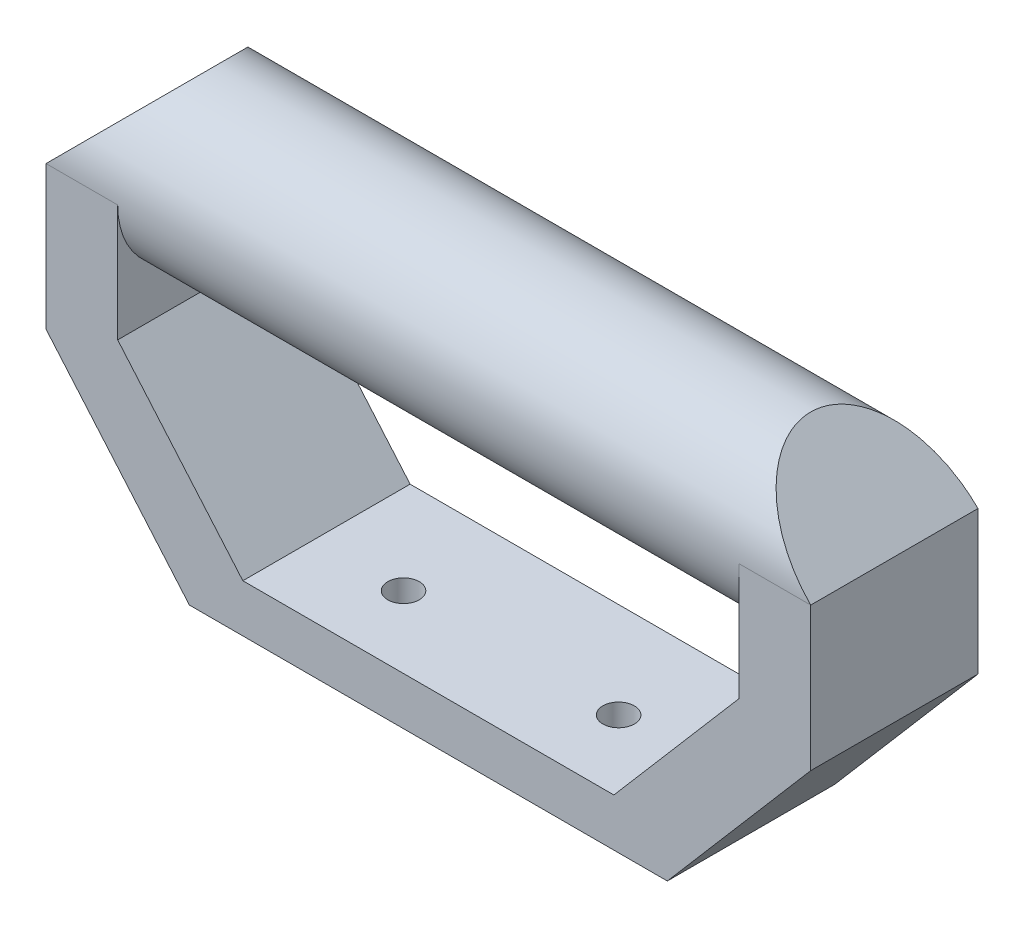
ISO-10303-21;
HEADER;
FILE_DESCRIPTION(('STEP AP214'),'2;1');
FILE_NAME('part.step','',(''),(''),'','','');
FILE_SCHEMA(('AUTOMOTIVE_DESIGN { 1 0 10303 214 1 1 1 1 }'));
ENDSEC;
DATA;
#1=APPLICATION_CONTEXT('core data for automotive mechanical design processes');
#2=APPLICATION_PROTOCOL_DEFINITION('international standard','automotive_design',2000,#1);
#3=PRODUCT_CONTEXT('',#1,'mechanical');
#4=PRODUCT('Part','Part','',(#3));
#5=PRODUCT_RELATED_PRODUCT_CATEGORY('part','',(#4));
#6=PRODUCT_DEFINITION_FORMATION('','',#4);
#7=PRODUCT_DEFINITION_CONTEXT('part definition',#1,'design');
#8=PRODUCT_DEFINITION('design','',#6,#7);
#9=PRODUCT_DEFINITION_SHAPE('','',#8);
#10=(LENGTH_UNIT() NAMED_UNIT(*) SI_UNIT(.MILLI.,.METRE.));
#11=(NAMED_UNIT(*) PLANE_ANGLE_UNIT() SI_UNIT($,.RADIAN.));
#12=(NAMED_UNIT(*) SI_UNIT($,.STERADIAN.) SOLID_ANGLE_UNIT());
#13=UNCERTAINTY_MEASURE_WITH_UNIT(LENGTH_MEASURE(1.E-05),#10,'distance_accuracy_value','');
#14=(GEOMETRIC_REPRESENTATION_CONTEXT(3) GLOBAL_UNCERTAINTY_ASSIGNED_CONTEXT((#13)) GLOBAL_UNIT_ASSIGNED_CONTEXT((#10,
#11,#12)) REPRESENTATION_CONTEXT('',''));
#15=CARTESIAN_POINT('',(0.,0.,0.));
#16=DIRECTION('',(0.,0.,1.));
#17=DIRECTION('',(1.,0.,0.));
#18=AXIS2_PLACEMENT_3D('',#15,#16,#17);
#19=CARTESIAN_POINT('',(0.,10.,0.));
#20=DIRECTION('',(0.,0.,-1.));
#21=DIRECTION('',(-1.,0.,0.));
#22=AXIS2_PLACEMENT_3D('',#19,#20,#21);
#23=PLANE('',#22);
#24=DIRECTION('',(1.,0.,0.));
#25=VECTOR('',#24,1.);
#26=CARTESIAN_POINT('',(0.,0.,0.));
#27=LINE('',#26,#25);
#28=CARTESIAN_POINT('',(0.,0.,0.));
#29=VERTEX_POINT('',#28);
#30=CARTESIAN_POINT('',(100.,0.,0.));
#31=VERTEX_POINT('',#30);
#32=EDGE_CURVE('E250',#29,#31,#27,.T.);
#33=ORIENTED_EDGE('',*,*,#32,.T.);
#34=DIRECTION('',(0.650791373455968,0.759256602365297,0.));
#35=VECTOR('',#34,1.);
#36=CARTESIAN_POINT('',(100.,0.,0.));
#37=LINE('',#36,#35);
#38=CARTESIAN_POINT('',(130.,35.,0.));
#39=VERTEX_POINT('',#38);
#40=EDGE_CURVE('E189',#31,#39,#37,.T.);
#41=ORIENTED_EDGE('',*,*,#40,.T.);
#42=DIRECTION('',(0.,1.,0.));
#43=VECTOR('',#42,1.);
#44=CARTESIAN_POINT('',(130.,35.,0.));
#45=LINE('',#44,#43);
#46=CARTESIAN_POINT('',(130.,65.,0.));
#47=VERTEX_POINT('',#46);
#48=EDGE_CURVE('E178',#39,#47,#45,.T.);
#49=ORIENTED_EDGE('',*,*,#48,.T.);
#50=DIRECTION('',(1.,0.,0.));
#51=VECTOR('',#50,1.);
#52=CARTESIAN_POINT('',(122.5,65.,0.));
#53=LINE('',#52,#51);
#54=CARTESIAN_POINT('',(115.,65.,0.));
#55=VERTEX_POINT('',#54);
#56=EDGE_CURVE('E57',#55,#47,#53,.T.);
#57=ORIENTED_EDGE('',*,*,#56,.F.);
#58=DIRECTION('',(0.,-1.,0.));
#59=VECTOR('',#58,1.);
#60=CARTESIAN_POINT('',(115.,65.,0.));
#61=LINE('',#60,#59);
#62=CARTESIAN_POINT('',(115.,40.5488611432322,0.));
#63=VERTEX_POINT('',#62);
#64=EDGE_CURVE('E196',#55,#63,#61,.T.);
#65=ORIENTED_EDGE('',*,*,#64,.T.);
#66=DIRECTION('',(-0.650791373455969,-0.759256602365296,0.));
#67=VECTOR('',#66,1.);
#68=CARTESIAN_POINT('',(115.,40.5488611432322,0.));
#69=LINE('',#68,#67);
#70=CARTESIAN_POINT('',(88.8152618772295,10.,0.));
#71=VERTEX_POINT('',#70);
#72=EDGE_CURVE('E193',#63,#71,#69,.T.);
#73=ORIENTED_EDGE('',*,*,#72,.T.);
#74=DIRECTION('',(1.,0.,0.));
#75=VECTOR('',#74,1.);
#76=CARTESIAN_POINT('',(0.,10.,0.));
#77=LINE('',#76,#75);
#78=CARTESIAN_POINT('',(11.1847381227705,10.,0.));
#79=VERTEX_POINT('',#78);
#80=EDGE_CURVE('E141',#79,#71,#77,.T.);
#81=ORIENTED_EDGE('',*,*,#80,.F.);
#82=DIRECTION('',(-0.650791373455969,0.759256602365296,0.));
#83=VECTOR('',#82,1.);
#84=CARTESIAN_POINT('',(-15.,40.5488611432322,0.));
#85=LINE('',#84,#83);
#86=CARTESIAN_POINT('',(-15.,40.5488611432322,0.));
#87=VERTEX_POINT('',#86);
#88=EDGE_CURVE('E198',#79,#87,#85,.T.);
#89=ORIENTED_EDGE('',*,*,#88,.T.);
#90=DIRECTION('',(0.,1.,0.));
#91=VECTOR('',#90,1.);
#92=CARTESIAN_POINT('',(-15.,65.,0.));
#93=LINE('',#92,#91);
#94=CARTESIAN_POINT('',(-15.,65.,0.));
#95=VERTEX_POINT('',#94);
#96=EDGE_CURVE('E219',#87,#95,#93,.T.);
#97=ORIENTED_EDGE('',*,*,#96,.T.);
#98=DIRECTION('',(1.,0.,0.));
#99=VECTOR('',#98,1.);
#100=CARTESIAN_POINT('',(-22.5,65.,0.));
#101=LINE('',#100,#99);
#102=CARTESIAN_POINT('',(-30.,65.,0.));
#103=VERTEX_POINT('',#102);
#104=EDGE_CURVE('E263',#95,#103,#101,.F.);
#105=ORIENTED_EDGE('',*,*,#104,.T.);
#106=DIRECTION('',(0.,-1.,0.));
#107=VECTOR('',#106,1.);
#108=CARTESIAN_POINT('',(-30.,35.,0.));
#109=LINE('',#108,#107);
#110=CARTESIAN_POINT('',(-30.,35.,0.));
#111=VERTEX_POINT('',#110);
#112=EDGE_CURVE('E73',#103,#111,#109,.T.);
#113=ORIENTED_EDGE('',*,*,#112,.T.);
#114=DIRECTION('',(0.650791373455968,-0.759256602365297,0.));
#115=VECTOR('',#114,1.);
#116=CARTESIAN_POINT('',(0.,0.,0.));
#117=LINE('',#116,#115);
#118=EDGE_CURVE('E225',#111,#29,#117,.T.);
#119=ORIENTED_EDGE('',*,*,#118,.T.);
#120=EDGE_LOOP('',(#33,#41,#49,#57,#65,#73,#81,#89,#97,#105,#113,#119));
#121=FACE_BOUND('',#120,.T.);
#122=ADVANCED_FACE('F47',(#121),#23,.F.);
#123=CARTESIAN_POINT('',(0.,10.,-35.));
#124=DIRECTION('',(0.,0.,1.));
#125=DIRECTION('',(1.,0.,0.));
#126=AXIS2_PLACEMENT_3D('',#123,#124,#125);
#127=PLANE('',#126);
#128=DIRECTION('',(-0.650791373455968,-0.759256602365297,0.));
#129=VECTOR('',#128,1.);
#130=CARTESIAN_POINT('',(100.,0.,-35.));
#131=LINE('',#130,#129);
#132=CARTESIAN_POINT('',(130.,35.,-35.));
#133=VERTEX_POINT('',#132);
#134=CARTESIAN_POINT('',(100.,0.,-35.));
#135=VERTEX_POINT('',#134);
#136=EDGE_CURVE('E186',#133,#135,#131,.T.);
#137=ORIENTED_EDGE('',*,*,#136,.T.);
#138=DIRECTION('',(-1.,0.,0.));
#139=VECTOR('',#138,1.);
#140=CARTESIAN_POINT('',(0.,0.,-35.));
#141=LINE('',#140,#139);
#142=CARTESIAN_POINT('',(0.,0.,-35.));
#143=VERTEX_POINT('',#142);
#144=EDGE_CURVE('E245',#135,#143,#141,.T.);
#145=ORIENTED_EDGE('',*,*,#144,.T.);
#146=DIRECTION('',(-0.650791373455968,0.759256602365297,0.));
#147=VECTOR('',#146,1.);
#148=CARTESIAN_POINT('',(0.,0.,-35.));
#149=LINE('',#148,#147);
#150=CARTESIAN_POINT('',(-30.,35.,-35.));
#151=VERTEX_POINT('',#150);
#152=EDGE_CURVE('E213',#143,#151,#149,.T.);
#153=ORIENTED_EDGE('',*,*,#152,.T.);
#154=DIRECTION('',(0.,1.,0.));
#155=VECTOR('',#154,1.);
#156=CARTESIAN_POINT('',(-30.,35.,-35.));
#157=LINE('',#156,#155);
#158=CARTESIAN_POINT('',(-29.9999999999999,65.,-35.));
#159=VERTEX_POINT('',#158);
#160=EDGE_CURVE('E208',#151,#159,#157,.T.);
#161=ORIENTED_EDGE('',*,*,#160,.T.);
#162=DIRECTION('',(1.,0.,0.));
#163=VECTOR('',#162,1.);
#164=CARTESIAN_POINT('',(-22.5,65.,-35.));
#165=LINE('',#164,#163);
#166=CARTESIAN_POINT('',(-15.,65.,-35.));
#167=VERTEX_POINT('',#166);
#168=EDGE_CURVE('E267',#167,#159,#165,.F.);
#169=ORIENTED_EDGE('',*,*,#168,.F.);
#170=DIRECTION('',(0.,-1.,0.));
#171=VECTOR('',#170,1.);
#172=CARTESIAN_POINT('',(-15.,65.,-35.));
#173=LINE('',#172,#171);
#174=CARTESIAN_POINT('',(-15.,40.5488611432322,-35.));
#175=VERTEX_POINT('',#174);
#176=EDGE_CURVE('E205',#167,#175,#173,.T.);
#177=ORIENTED_EDGE('',*,*,#176,.T.);
#178=DIRECTION('',(0.650791373455969,-0.759256602365296,0.));
#179=VECTOR('',#178,1.);
#180=CARTESIAN_POINT('',(-15.,40.5488611432322,-35.));
#181=LINE('',#180,#179);
#182=CARTESIAN_POINT('',(11.1847381227705,10.,-35.));
#183=VERTEX_POINT('',#182);
#184=EDGE_CURVE('E157',#175,#183,#181,.T.);
#185=ORIENTED_EDGE('',*,*,#184,.T.);
#186=DIRECTION('',(-1.,0.,0.));
#187=VECTOR('',#186,1.);
#188=CARTESIAN_POINT('',(0.,10.,-35.));
#189=LINE('',#188,#187);
#190=CARTESIAN_POINT('',(88.8152618772295,10.,-35.));
#191=VERTEX_POINT('',#190);
#192=EDGE_CURVE('E138',#191,#183,#189,.T.);
#193=ORIENTED_EDGE('',*,*,#192,.F.);
#194=DIRECTION('',(0.650791373455969,0.759256602365296,0.));
#195=VECTOR('',#194,1.);
#196=CARTESIAN_POINT('',(115.,40.5488611432322,-35.));
#197=LINE('',#196,#195);
#198=CARTESIAN_POINT('',(115.,40.5488611432322,-35.));
#199=VERTEX_POINT('',#198);
#200=EDGE_CURVE('E154',#191,#199,#197,.T.);
#201=ORIENTED_EDGE('',*,*,#200,.T.);
#202=DIRECTION('',(0.,1.,0.));
#203=VECTOR('',#202,1.);
#204=CARTESIAN_POINT('',(115.,65.,-35.));
#205=LINE('',#204,#203);
#206=CARTESIAN_POINT('',(115.,65.,-35.));
#207=VERTEX_POINT('',#206);
#208=EDGE_CURVE('E165',#199,#207,#205,.T.);
#209=ORIENTED_EDGE('',*,*,#208,.T.);
#210=DIRECTION('',(1.,0.,0.));
#211=VECTOR('',#210,1.);
#212=CARTESIAN_POINT('',(122.5,65.,-35.));
#213=LINE('',#212,#211);
#214=CARTESIAN_POINT('',(130.,65.,-35.));
#215=VERTEX_POINT('',#214);
#216=EDGE_CURVE('E11',#207,#215,#213,.T.);
#217=ORIENTED_EDGE('',*,*,#216,.T.);
#218=DIRECTION('',(0.,-1.,0.));
#219=VECTOR('',#218,1.);
#220=CARTESIAN_POINT('',(130.,35.,-35.));
#221=LINE('',#220,#219);
#222=EDGE_CURVE('E170',#215,#133,#221,.T.);
#223=ORIENTED_EDGE('',*,*,#222,.T.);
#224=EDGE_LOOP('',(#137,#145,#153,#161,#169,#177,#185,#193,#201,#209,#217,#223));
#225=FACE_BOUND('',#224,.T.);
#226=ADVANCED_FACE('F152',(#225),#127,.F.);
#227=CARTESIAN_POINT('',(0.,10.,0.));
#228=DIRECTION('',(0.,-1.,0.));
#229=DIRECTION('',(0.,0.,-1.));
#230=AXIS2_PLACEMENT_3D('',#227,#228,#229);
#231=PLANE('',#230);
#232=CARTESIAN_POINT('',(74.8052618772295,10.,-15.));
#233=DIRECTION('',(0.,1.,0.));
#234=DIRECTION('',(0.,0.,1.));
#235=AXIS2_PLACEMENT_3D('',#232,#233,#234);
#236=CIRCLE('',#235,3.3);
#237=CARTESIAN_POINT('',(74.8052618772295,10.,-11.7));
#238=VERTEX_POINT('',#237);
#239=EDGE_CURVE('E307',#238,#238,#236,.T.);
#240=ORIENTED_EDGE('',*,*,#239,.F.);
#241=EDGE_LOOP('',(#240));
#242=FACE_BOUND('',#241,.T.);
#243=CARTESIAN_POINT('',(29.8052618772295,10.,-15.));
#244=DIRECTION('',(0.,1.,0.));
#245=DIRECTION('',(0.,0.,1.));
#246=AXIS2_PLACEMENT_3D('',#243,#244,#245);
#247=CIRCLE('',#246,3.3);
#248=CARTESIAN_POINT('',(29.8052618772295,10.,-11.7));
#249=VERTEX_POINT('',#248);
#250=EDGE_CURVE('E297',#249,#249,#247,.T.);
#251=ORIENTED_EDGE('',*,*,#250,.F.);
#252=EDGE_LOOP('',(#251));
#253=FACE_BOUND('',#252,.T.);
#254=ORIENTED_EDGE('',*,*,#80,.T.);
#255=DIRECTION('',(0.,0.,1.));
#256=VECTOR('',#255,1.);
#257=CARTESIAN_POINT('',(88.8152618772295,10.,-111.949221271181));
#258=LINE('',#257,#256);
#259=EDGE_CURVE('E135',#191,#71,#258,.T.);
#260=ORIENTED_EDGE('',*,*,#259,.F.);
#261=ORIENTED_EDGE('',*,*,#192,.T.);
#262=DIRECTION('',(0.,0.,1.));
#263=VECTOR('',#262,1.);
#264=CARTESIAN_POINT('',(11.1847381227705,10.,-111.949221271181));
#265=LINE('',#264,#263);
#266=EDGE_CURVE('E229',#183,#79,#265,.T.);
#267=ORIENTED_EDGE('',*,*,#266,.T.);
#268=EDGE_LOOP('',(#254,#260,#261,#267));
#269=FACE_BOUND('',#268,.T.);
#270=ADVANCED_FACE('F137',(#242,#253,#269),#231,.F.);
#271=CARTESIAN_POINT('',(0.,0.,0.));
#272=DIRECTION('',(0.,-1.,0.));
#273=DIRECTION('',(0.,0.,-1.));
#274=AXIS2_PLACEMENT_3D('',#271,#272,#273);
#275=PLANE('',#274);
#276=CARTESIAN_POINT('',(74.8052618772295,0.,-15.));
#277=DIRECTION('',(0.,1.,0.));
#278=DIRECTION('',(0.,0.,1.));
#279=AXIS2_PLACEMENT_3D('',#276,#277,#278);
#280=CIRCLE('',#279,3.3);
#281=CARTESIAN_POINT('',(74.8052618772295,0.,-11.7));
#282=VERTEX_POINT('',#281);
#283=EDGE_CURVE('E303',#282,#282,#280,.T.);
#284=ORIENTED_EDGE('',*,*,#283,.T.);
#285=EDGE_LOOP('',(#284));
#286=FACE_BOUND('',#285,.T.);
#287=CARTESIAN_POINT('',(29.8052618772295,0.,-15.));
#288=DIRECTION('',(0.,1.,0.));
#289=DIRECTION('',(0.,0.,1.));
#290=AXIS2_PLACEMENT_3D('',#287,#288,#289);
#291=CIRCLE('',#290,3.3);
#292=CARTESIAN_POINT('',(29.8052618772295,0.,-11.7));
#293=VERTEX_POINT('',#292);
#294=EDGE_CURVE('E294',#293,#293,#291,.T.);
#295=ORIENTED_EDGE('',*,*,#294,.T.);
#296=EDGE_LOOP('',(#295));
#297=FACE_BOUND('',#296,.T.);
#298=DIRECTION('',(0.,0.,1.));
#299=VECTOR('',#298,1.);
#300=CARTESIAN_POINT('',(0.,0.,0.));
#301=LINE('',#300,#299);
#302=EDGE_CURVE('E243',#143,#29,#301,.T.);
#303=ORIENTED_EDGE('',*,*,#302,.F.);
#304=ORIENTED_EDGE('',*,*,#144,.F.);
#305=DIRECTION('',(0.,0.,-1.));
#306=VECTOR('',#305,1.);
#307=CARTESIAN_POINT('',(100.,0.,0.));
#308=LINE('',#307,#306);
#309=EDGE_CURVE('E253',#31,#135,#308,.T.);
#310=ORIENTED_EDGE('',*,*,#309,.F.);
#311=ORIENTED_EDGE('',*,*,#32,.F.);
#312=EDGE_LOOP('',(#303,#304,#310,#311));
#313=FACE_BOUND('',#312,.T.);
#314=ADVANCED_FACE('F316',(#286,#297,#313),#275,.T.);
#315=CARTESIAN_POINT('',(0.,0.,-111.949221271181));
#316=DIRECTION('',(-0.759256602365297,-0.650791373455968,0.));
#317=DIRECTION('',(0.650791373455968,-0.759256602365297,0.));
#318=AXIS2_PLACEMENT_3D('',#315,#316,#317);
#319=PLANE('',#318);
#320=ORIENTED_EDGE('',*,*,#152,.F.);
#321=ORIENTED_EDGE('',*,*,#302,.T.);
#322=ORIENTED_EDGE('',*,*,#118,.F.);
#323=DIRECTION('',(0.,0.,1.));
#324=VECTOR('',#323,1.);
#325=CARTESIAN_POINT('',(-30.,35.,-111.949221271181));
#326=LINE('',#325,#324);
#327=EDGE_CURVE('E209',#151,#111,#326,.T.);
#328=ORIENTED_EDGE('',*,*,#327,.F.);
#329=EDGE_LOOP('',(#320,#321,#322,#328));
#330=FACE_BOUND('',#329,.T.);
#331=ADVANCED_FACE('F359',(#330),#319,.T.);
#332=CARTESIAN_POINT('',(-30.,35.,-111.949221271181));
#333=DIRECTION('',(-1.,0.,0.));
#334=DIRECTION('',(0.,0.,1.));
#335=AXIS2_PLACEMENT_3D('',#332,#333,#334);
#336=PLANE('',#335);
#337=ORIENTED_EDGE('',*,*,#160,.F.);
#338=ORIENTED_EDGE('',*,*,#327,.T.);
#339=ORIENTED_EDGE('',*,*,#112,.F.);
#340=DIRECTION('',(0.,0.,1.));
#341=VECTOR('',#340,1.);
#342=CARTESIAN_POINT('',(-30.,65.,-111.949221271181));
#343=LINE('',#342,#341);
#344=EDGE_CURVE('E232',#159,#103,#343,.T.);
#345=ORIENTED_EDGE('',*,*,#344,.F.);
#346=EDGE_LOOP('',(#337,#338,#339,#345));
#347=FACE_BOUND('',#346,.T.);
#348=ADVANCED_FACE('F356',(#347),#336,.T.);
#349=CARTESIAN_POINT('',(-15.,65.,-111.949221271181));
#350=DIRECTION('',(1.,0.,0.));
#351=DIRECTION('',(0.,1.,0.));
#352=AXIS2_PLACEMENT_3D('',#349,#350,#351);
#353=PLANE('',#352);
#354=ORIENTED_EDGE('',*,*,#176,.F.);
#355=CARTESIAN_POINT('',(-15.,65.,-17.5));
#356=DIRECTION('',(1.,0.,0.));
#357=DIRECTION('',(0.,1.,0.));
#358=AXIS2_PLACEMENT_3D('',#355,#356,#357);
#359=CIRCLE('',#358,17.5);
#360=EDGE_CURVE('E166',#95,#167,#359,.T.);
#361=ORIENTED_EDGE('',*,*,#360,.F.);
#362=ORIENTED_EDGE('',*,*,#96,.F.);
#363=DIRECTION('',(0.,0.,1.));
#364=VECTOR('',#363,1.);
#365=CARTESIAN_POINT('',(-15.,40.5488611432322,-111.949221271181));
#366=LINE('',#365,#364);
#367=EDGE_CURVE('E236',#175,#87,#366,.T.);
#368=ORIENTED_EDGE('',*,*,#367,.F.);
#369=EDGE_LOOP('',(#354,#361,#362,#368));
#370=FACE_BOUND('',#369,.T.);
#371=ADVANCED_FACE('F358',(#370),#353,.T.);
#372=CARTESIAN_POINT('',(-15.,40.5488611432322,-111.949221271181));
#373=DIRECTION('',(0.759256602365296,0.650791373455969,0.));
#374=DIRECTION('',(-0.650791373455969,0.759256602365296,0.));
#375=AXIS2_PLACEMENT_3D('',#372,#373,#374);
#376=PLANE('',#375);
#377=ORIENTED_EDGE('',*,*,#184,.F.);
#378=ORIENTED_EDGE('',*,*,#367,.T.);
#379=ORIENTED_EDGE('',*,*,#88,.F.);
#380=ORIENTED_EDGE('',*,*,#266,.F.);
#381=EDGE_LOOP('',(#377,#378,#379,#380));
#382=FACE_BOUND('',#381,.T.);
#383=ADVANCED_FACE('F365',(#382),#376,.T.);
#384=CARTESIAN_POINT('',(115.,65.,-111.949221271181));
#385=DIRECTION('',(-1.,0.,0.));
#386=DIRECTION('',(0.,0.,1.));
#387=AXIS2_PLACEMENT_3D('',#384,#385,#386);
#388=PLANE('',#387);
#389=ORIENTED_EDGE('',*,*,#64,.F.);
#390=CARTESIAN_POINT('',(115.,65.,-17.5));
#391=DIRECTION('',(-1.,0.,0.));
#392=DIRECTION('',(0.,0.,1.));
#393=AXIS2_PLACEMENT_3D('',#390,#391,#392);
#394=CIRCLE('',#393,17.5);
#395=EDGE_CURVE('E173',#207,#55,#394,.T.);
#396=ORIENTED_EDGE('',*,*,#395,.F.);
#397=ORIENTED_EDGE('',*,*,#208,.F.);
#398=DIRECTION('',(0.,0.,1.));
#399=VECTOR('',#398,1.);
#400=CARTESIAN_POINT('',(115.,40.5488611432322,-111.949221271181));
#401=LINE('',#400,#399);
#402=EDGE_CURVE('E147',#199,#63,#401,.T.);
#403=ORIENTED_EDGE('',*,*,#402,.T.);
#404=EDGE_LOOP('',(#389,#396,#397,#403));
#405=FACE_BOUND('',#404,.T.);
#406=ADVANCED_FACE('F292',(#405),#388,.T.);
#407=CARTESIAN_POINT('',(130.,35.,-111.949221271181));
#408=DIRECTION('',(1.,0.,0.));
#409=DIRECTION('',(0.,0.,-1.));
#410=AXIS2_PLACEMENT_3D('',#407,#408,#409);
#411=PLANE('',#410);
#412=ORIENTED_EDGE('',*,*,#222,.F.);
#413=DIRECTION('',(0.,0.,1.));
#414=VECTOR('',#413,1.);
#415=CARTESIAN_POINT('',(130.,65.,-111.949221271181));
#416=LINE('',#415,#414);
#417=EDGE_CURVE('E182',#215,#47,#416,.T.);
#418=ORIENTED_EDGE('',*,*,#417,.T.);
#419=ORIENTED_EDGE('',*,*,#48,.F.);
#420=DIRECTION('',(0.,0.,1.));
#421=VECTOR('',#420,1.);
#422=CARTESIAN_POINT('',(130.,35.,-111.949221271181));
#423=LINE('',#422,#421);
#424=EDGE_CURVE('E148',#133,#39,#423,.T.);
#425=ORIENTED_EDGE('',*,*,#424,.F.);
#426=EDGE_LOOP('',(#412,#418,#419,#425));
#427=FACE_BOUND('',#426,.T.);
#428=ADVANCED_FACE('F276',(#427),#411,.T.);
#429=CARTESIAN_POINT('',(100.,0.,-111.949221271181));
#430=DIRECTION('',(0.759256602365297,-0.650791373455968,0.));
#431=DIRECTION('',(0.650791373455968,0.759256602365297,0.));
#432=AXIS2_PLACEMENT_3D('',#429,#430,#431);
#433=PLANE('',#432);
#434=ORIENTED_EDGE('',*,*,#136,.F.);
#435=ORIENTED_EDGE('',*,*,#424,.T.);
#436=ORIENTED_EDGE('',*,*,#40,.F.);
#437=ORIENTED_EDGE('',*,*,#309,.T.);
#438=EDGE_LOOP('',(#434,#435,#436,#437));
#439=FACE_BOUND('',#438,.T.);
#440=ADVANCED_FACE('F282',(#439),#433,.T.);
#441=CARTESIAN_POINT('',(115.,40.5488611432322,-111.949221271181));
#442=DIRECTION('',(-0.759256602365296,0.650791373455969,0.));
#443=DIRECTION('',(-0.650791373455969,-0.759256602365296,0.));
#444=AXIS2_PLACEMENT_3D('',#441,#442,#443);
#445=PLANE('',#444);
#446=ORIENTED_EDGE('',*,*,#200,.F.);
#447=ORIENTED_EDGE('',*,*,#259,.T.);
#448=ORIENTED_EDGE('',*,*,#72,.F.);
#449=ORIENTED_EDGE('',*,*,#402,.F.);
#450=EDGE_LOOP('',(#446,#447,#448,#449));
#451=FACE_BOUND('',#450,.T.);
#452=ADVANCED_FACE('F163',(#451),#445,.T.);
#453=CARTESIAN_POINT('',(-64.4974746830583,65.,-17.5));
#454=DIRECTION('',(1.,0.,0.));
#455=DIRECTION('',(0.,0.,-1.));
#456=AXIS2_PLACEMENT_3D('',#453,#454,#455);
#457=CYLINDRICAL_SURFACE('',#456,17.5);
#458=ORIENTED_EDGE('',*,*,#168,.T.);
#459=CARTESIAN_POINT('',(-29.9999999999999,65.,-17.5));
#460=DIRECTION('',(0.707106781186551,-0.707106781186544,0.));
#461=DIRECTION('',(0.707106781186544,0.707106781186551,0.));
#462=AXIS2_PLACEMENT_3D('',#459,#460,#461);
#463=ELLIPSE('',#462,24.7487373415291,17.5);
#464=EDGE_CURVE('E160',#159,#103,#463,.T.);
#465=ORIENTED_EDGE('',*,*,#464,.T.);
#466=ORIENTED_EDGE('',*,*,#104,.F.);
#467=ORIENTED_EDGE('',*,*,#360,.T.);
#468=EDGE_LOOP('',(#458,#465,#466,#467));
#469=FACE_BOUND('',#468,.T.);
#470=CARTESIAN_POINT('',(130.,65.,-17.5));
#471=DIRECTION('',(-0.707106781186545,-0.70710678118655,0.));
#472=DIRECTION('',(0.70710678118655,-0.707106781186545,0.));
#473=AXIS2_PLACEMENT_3D('',#470,#471,#472);
#474=ELLIPSE('',#473,24.7487373415293,17.5);
#475=EDGE_CURVE('E64',#47,#215,#474,.T.);
#476=ORIENTED_EDGE('',*,*,#475,.T.);
#477=ORIENTED_EDGE('',*,*,#216,.F.);
#478=ORIENTED_EDGE('',*,*,#395,.T.);
#479=ORIENTED_EDGE('',*,*,#56,.T.);
#480=EDGE_LOOP('',(#476,#477,#478,#479));
#481=FACE_BOUND('',#480,.T.);
#482=ADVANCED_FACE('F271',(#469,#481),#457,.T.);
#483=CARTESIAN_POINT('',(-15.,80.0000000000001,-111.949221271181));
#484=DIRECTION('',(0.707106781186551,-0.707106781186544,0.));
#485=DIRECTION('',(0.,0.,1.));
#486=AXIS2_PLACEMENT_3D('',#483,#484,#485);
#487=PLANE('',#486);
#488=ORIENTED_EDGE('',*,*,#464,.F.);
#489=ORIENTED_EDGE('',*,*,#344,.T.);
#490=EDGE_LOOP('',(#488,#489));
#491=FACE_BOUND('',#490,.T.);
#492=ADVANCED_FACE('F331',(#491),#487,.F.);
#493=CARTESIAN_POINT('',(130.,65.,-111.949221271181));
#494=DIRECTION('',(-0.707106781186545,-0.70710678118655,0.));
#495=DIRECTION('',(0.,0.,1.));
#496=AXIS2_PLACEMENT_3D('',#493,#494,#495);
#497=PLANE('',#496);
#498=ORIENTED_EDGE('',*,*,#417,.F.);
#499=ORIENTED_EDGE('',*,*,#475,.F.);
#500=EDGE_LOOP('',(#498,#499));
#501=FACE_BOUND('',#500,.T.);
#502=ADVANCED_FACE('F50',(#501),#497,.F.);
#503=CARTESIAN_POINT('',(29.8052618772295,10.,-15.));
#504=DIRECTION('',(0.,1.,0.));
#505=DIRECTION('',(0.,0.,1.));
#506=AXIS2_PLACEMENT_3D('',#503,#504,#505);
#507=CYLINDRICAL_SURFACE('',#506,3.3);
#508=ORIENTED_EDGE('',*,*,#294,.F.);
#509=EDGE_LOOP('',(#508));
#510=FACE_BOUND('',#509,.T.);
#511=ORIENTED_EDGE('',*,*,#250,.T.);
#512=EDGE_LOOP('',(#511));
#513=FACE_BOUND('',#512,.T.);
#514=ADVANCED_FACE('F320',(#510,#513),#507,.F.);
#515=CARTESIAN_POINT('',(74.8052618772295,10.,-15.));
#516=DIRECTION('',(0.,1.,0.));
#517=DIRECTION('',(0.,0.,1.));
#518=AXIS2_PLACEMENT_3D('',#515,#516,#517);
#519=CYLINDRICAL_SURFACE('',#518,3.3);
#520=ORIENTED_EDGE('',*,*,#283,.F.);
#521=EDGE_LOOP('',(#520));
#522=FACE_BOUND('',#521,.T.);
#523=ORIENTED_EDGE('',*,*,#239,.T.);
#524=EDGE_LOOP('',(#523));
#525=FACE_BOUND('',#524,.T.);
#526=ADVANCED_FACE('F312',(#522,#525),#519,.F.);
#527=CLOSED_SHELL('',(#122,#226,#270,#314,#331,#348,#371,#383,#406,#428,#440,#452,#482,#492,
#502,#514,#526));
#528=MANIFOLD_SOLID_BREP('B2',#527);
#529=ADVANCED_BREP_SHAPE_REPRESENTATION('',(#18,#528),#14);
#530=SHAPE_DEFINITION_REPRESENTATION(#9,#529);
ENDSEC;
END-ISO-10303-21;
